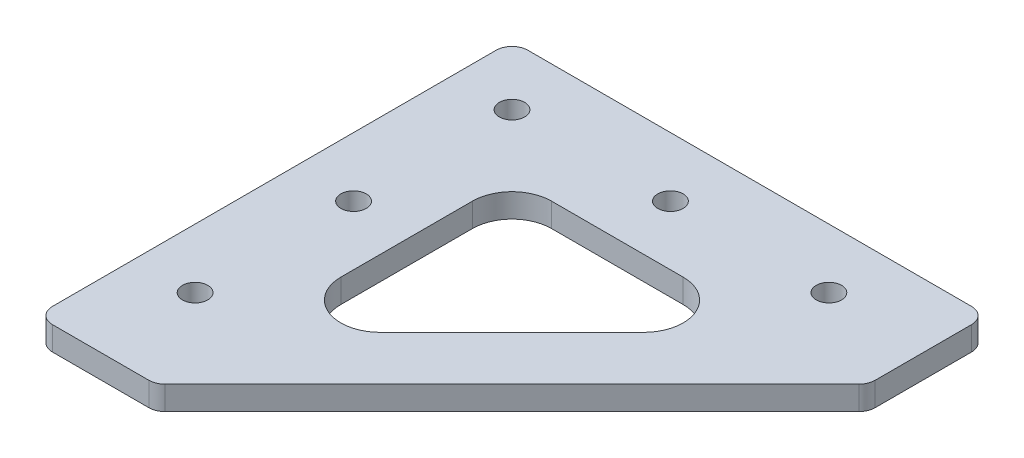
ISO-10303-21;
HEADER;
FILE_DESCRIPTION(('STEP AP214'),'2;1');
FILE_NAME('part.step','',(''),(''),'','','');
FILE_SCHEMA(('AUTOMOTIVE_DESIGN { 1 0 10303 214 1 1 1 1 }'));
ENDSEC;
DATA;
#1=APPLICATION_CONTEXT('core data for automotive mechanical design processes');
#2=APPLICATION_PROTOCOL_DEFINITION('international standard','automotive_design',2000,#1);
#3=PRODUCT_CONTEXT('',#1,'mechanical');
#4=PRODUCT('Part','Part','',(#3));
#5=PRODUCT_RELATED_PRODUCT_CATEGORY('part','',(#4));
#6=PRODUCT_DEFINITION_FORMATION('','',#4);
#7=PRODUCT_DEFINITION_CONTEXT('part definition',#1,'design');
#8=PRODUCT_DEFINITION('design','',#6,#7);
#9=PRODUCT_DEFINITION_SHAPE('','',#8);
#10=(LENGTH_UNIT() NAMED_UNIT(*) SI_UNIT(.MILLI.,.METRE.));
#11=(NAMED_UNIT(*) PLANE_ANGLE_UNIT() SI_UNIT($,.RADIAN.));
#12=(NAMED_UNIT(*) SI_UNIT($,.STERADIAN.) SOLID_ANGLE_UNIT());
#13=UNCERTAINTY_MEASURE_WITH_UNIT(LENGTH_MEASURE(1.E-05),#10,'distance_accuracy_value','');
#14=(GEOMETRIC_REPRESENTATION_CONTEXT(3) GLOBAL_UNCERTAINTY_ASSIGNED_CONTEXT((#13)) GLOBAL_UNIT_ASSIGNED_CONTEXT((#10,
#11,#12)) REPRESENTATION_CONTEXT('',''));
#15=CARTESIAN_POINT('',(0.,0.,0.));
#16=DIRECTION('',(0.,0.,1.));
#17=DIRECTION('',(1.,0.,0.));
#18=AXIS2_PLACEMENT_3D('',#15,#16,#17);
#19=CARTESIAN_POINT('',(0.,3.,0.));
#20=DIRECTION('',(0.,-1.,0.));
#21=DIRECTION('',(0.,0.,-1.));
#22=AXIS2_PLACEMENT_3D('',#19,#20,#21);
#23=PLANE('',#22);
#24=DIRECTION('',(0.,0.,1.));
#25=VECTOR('',#24,1.);
#26=CARTESIAN_POINT('',(-15.,3.,45.));
#27=LINE('',#26,#25);
#28=CARTESIAN_POINT('',(-15.,3.,-13.));
#29=VERTEX_POINT('',#28);
#30=CARTESIAN_POINT('',(-15.,3.,43.));
#31=VERTEX_POINT('',#30);
#32=EDGE_CURVE('E287',#29,#31,#27,.T.);
#33=ORIENTED_EDGE('',*,*,#32,.T.);
#34=CARTESIAN_POINT('',(-13.,3.,43.));
#35=DIRECTION('',(0.,-1.,0.));
#36=DIRECTION('',(0.,0.,-1.));
#37=AXIS2_PLACEMENT_3D('',#34,#35,#36);
#38=CIRCLE('',#37,2.);
#39=CARTESIAN_POINT('',(-13.,3.,45.));
#40=VERTEX_POINT('',#39);
#41=EDGE_CURVE('E211',#31,#40,#38,.F.);
#42=ORIENTED_EDGE('',*,*,#41,.T.);
#43=DIRECTION('',(1.,0.,0.));
#44=VECTOR('',#43,1.);
#45=CARTESIAN_POINT('',(0.,3.,45.));
#46=LINE('',#45,#44);
#47=CARTESIAN_POINT('',(-0.828427124746185,3.,45.));
#48=VERTEX_POINT('',#47);
#49=EDGE_CURVE('E176',#40,#48,#46,.T.);
#50=ORIENTED_EDGE('',*,*,#49,.T.);
#51=CARTESIAN_POINT('',(-0.828427124746185,3.,43.));
#52=DIRECTION('',(0.,-1.,0.));
#53=DIRECTION('',(0.,0.,-1.));
#54=AXIS2_PLACEMENT_3D('',#51,#52,#53);
#55=CIRCLE('',#54,2.);
#56=CARTESIAN_POINT('',(0.58578643762691,3.,44.4142135623731));
#57=VERTEX_POINT('',#56);
#58=EDGE_CURVE('E203',#48,#57,#55,.F.);
#59=ORIENTED_EDGE('',*,*,#58,.T.);
#60=DIRECTION('',(0.707106781186547,0.,-0.707106781186548));
#61=VECTOR('',#60,1.);
#62=CARTESIAN_POINT('',(0.,3.,45.));
#63=LINE('',#62,#61);
#64=CARTESIAN_POINT('',(44.4142135623731,3.,0.585786437626905));
#65=VERTEX_POINT('',#64);
#66=EDGE_CURVE('E183',#57,#65,#63,.T.);
#67=ORIENTED_EDGE('',*,*,#66,.T.);
#68=CARTESIAN_POINT('',(43.,3.,-0.828427124746192));
#69=DIRECTION('',(0.,-1.,0.));
#70=DIRECTION('',(0.,0.,-1.));
#71=AXIS2_PLACEMENT_3D('',#68,#69,#70);
#72=CIRCLE('',#71,2.);
#73=CARTESIAN_POINT('',(45.,3.,-0.828427124746192));
#74=VERTEX_POINT('',#73);
#75=EDGE_CURVE('E205',#65,#74,#72,.F.);
#76=ORIENTED_EDGE('',*,*,#75,.T.);
#77=DIRECTION('',(0.,0.,-1.));
#78=VECTOR('',#77,1.);
#79=CARTESIAN_POINT('',(45.,3.,-15.));
#80=LINE('',#79,#78);
#81=CARTESIAN_POINT('',(45.,3.,-13.));
#82=VERTEX_POINT('',#81);
#83=EDGE_CURVE('E187',#74,#82,#80,.T.);
#84=ORIENTED_EDGE('',*,*,#83,.T.);
#85=CARTESIAN_POINT('',(43.,3.,-13.));
#86=DIRECTION('',(0.,-1.,0.));
#87=DIRECTION('',(0.,0.,-1.));
#88=AXIS2_PLACEMENT_3D('',#85,#86,#87);
#89=CIRCLE('',#88,2.);
#90=CARTESIAN_POINT('',(43.,3.,-15.));
#91=VERTEX_POINT('',#90);
#92=EDGE_CURVE('E207',#82,#91,#89,.F.);
#93=ORIENTED_EDGE('',*,*,#92,.T.);
#94=DIRECTION('',(-1.,0.,0.));
#95=VECTOR('',#94,1.);
#96=CARTESIAN_POINT('',(-15.,3.,-15.));
#97=LINE('',#96,#95);
#98=CARTESIAN_POINT('',(-13.,3.,-15.));
#99=VERTEX_POINT('',#98);
#100=EDGE_CURVE('E284',#91,#99,#97,.T.);
#101=ORIENTED_EDGE('',*,*,#100,.T.);
#102=CARTESIAN_POINT('',(-13.,3.,-13.));
#103=DIRECTION('',(0.,-1.,0.));
#104=DIRECTION('',(0.,0.,-1.));
#105=AXIS2_PLACEMENT_3D('',#102,#103,#104);
#106=CIRCLE('',#105,2.);
#107=EDGE_CURVE('E209',#99,#29,#106,.F.);
#108=ORIENTED_EDGE('',*,*,#107,.T.);
#109=EDGE_LOOP('',(#33,#42,#50,#59,#67,#76,#84,#93,#101,#108));
#110=FACE_BOUND('',#109,.T.);
#111=DIRECTION('',(-1.,0.,0.));
#112=VECTOR('',#111,1.);
#113=CARTESIAN_POINT('',(0.,3.,0.));
#114=LINE('',#113,#112);
#115=CARTESIAN_POINT('',(21.6152236891498,3.,0.));
#116=VERTEX_POINT('',#115);
#117=CARTESIAN_POINT('',(5.,3.,0.));
#118=VERTEX_POINT('',#117);
#119=EDGE_CURVE('E276',#116,#118,#114,.T.);
#120=ORIENTED_EDGE('',*,*,#119,.F.);
#121=CARTESIAN_POINT('',(21.6152236891498,3.,5.));
#122=DIRECTION('',(0.,-1.,0.));
#123=DIRECTION('',(0.,0.,-1.));
#124=AXIS2_PLACEMENT_3D('',#121,#122,#123);
#125=CIRCLE('',#124,5.);
#126=CARTESIAN_POINT('',(25.1507575950825,3.,8.53553390593274));
#127=VERTEX_POINT('',#126);
#128=EDGE_CURVE('E11',#116,#127,#125,.T.);
#129=ORIENTED_EDGE('',*,*,#128,.T.);
#130=DIRECTION('',(0.707106781186548,0.,-0.707106781186548));
#131=VECTOR('',#130,1.);
#132=CARTESIAN_POINT('',(33.6862915010153,3.,0.));
#133=LINE('',#132,#131);
#134=CARTESIAN_POINT('',(8.53553390593274,3.,25.1507575950825));
#135=VERTEX_POINT('',#134);
#136=EDGE_CURVE('E267',#135,#127,#133,.T.);
#137=ORIENTED_EDGE('',*,*,#136,.F.);
#138=CARTESIAN_POINT('',(5.,3.,21.6152236891498));
#139=DIRECTION('',(0.,-1.,0.));
#140=DIRECTION('',(0.,0.,-1.));
#141=AXIS2_PLACEMENT_3D('',#138,#139,#140);
#142=CIRCLE('',#141,5.);
#143=CARTESIAN_POINT('',(0.,3.,21.6152236891498));
#144=VERTEX_POINT('',#143);
#145=EDGE_CURVE('E248',#135,#144,#142,.T.);
#146=ORIENTED_EDGE('',*,*,#145,.T.);
#147=DIRECTION('',(0.,0.,1.));
#148=VECTOR('',#147,1.);
#149=CARTESIAN_POINT('',(0.,3.,33.6862915010153));
#150=LINE('',#149,#148);
#151=CARTESIAN_POINT('',(0.,3.,5.));
#152=VERTEX_POINT('',#151);
#153=EDGE_CURVE('E270',#152,#144,#150,.T.);
#154=ORIENTED_EDGE('',*,*,#153,.F.);
#155=CARTESIAN_POINT('',(5.,3.,5.));
#156=DIRECTION('',(0.,-1.,0.));
#157=DIRECTION('',(0.,0.,-1.));
#158=AXIS2_PLACEMENT_3D('',#155,#156,#157);
#159=CIRCLE('',#158,5.);
#160=EDGE_CURVE('E244',#152,#118,#159,.T.);
#161=ORIENTED_EDGE('',*,*,#160,.T.);
#162=EDGE_LOOP('',(#120,#129,#137,#146,#154,#161));
#163=FACE_BOUND('',#162,.T.);
#164=CARTESIAN_POINT('',(-7.5,3.,12.5));
#165=DIRECTION('',(0.,1.,0.));
#166=DIRECTION('',(0.,0.,1.));
#167=AXIS2_PLACEMENT_3D('',#164,#165,#166);
#168=CIRCLE('',#167,1.6);
#169=CARTESIAN_POINT('',(-7.5,3.,14.1));
#170=VERTEX_POINT('',#169);
#171=EDGE_CURVE('E264',#170,#170,#168,.T.);
#172=ORIENTED_EDGE('',*,*,#171,.F.);
#173=EDGE_LOOP('',(#172));
#174=FACE_BOUND('',#173,.T.);
#175=CARTESIAN_POINT('',(-7.5,3.,32.5));
#176=DIRECTION('',(0.,1.,0.));
#177=DIRECTION('',(0.,0.,1.));
#178=AXIS2_PLACEMENT_3D('',#175,#176,#177);
#179=CIRCLE('',#178,1.6);
#180=CARTESIAN_POINT('',(-7.5,3.,34.1));
#181=VERTEX_POINT('',#180);
#182=EDGE_CURVE('E382',#181,#181,#179,.T.);
#183=ORIENTED_EDGE('',*,*,#182,.F.);
#184=EDGE_LOOP('',(#183));
#185=FACE_BOUND('',#184,.T.);
#186=CARTESIAN_POINT('',(-7.49999999999999,3.,-7.5));
#187=DIRECTION('',(0.,1.,0.));
#188=DIRECTION('',(0.,0.,1.));
#189=AXIS2_PLACEMENT_3D('',#186,#187,#188);
#190=CIRCLE('',#189,1.6);
#191=CARTESIAN_POINT('',(-7.49999999999999,3.,-5.9));
#192=VERTEX_POINT('',#191);
#193=EDGE_CURVE('E376',#192,#192,#190,.T.);
#194=ORIENTED_EDGE('',*,*,#193,.F.);
#195=EDGE_LOOP('',(#194));
#196=FACE_BOUND('',#195,.T.);
#197=CARTESIAN_POINT('',(12.5,3.,-7.5));
#198=DIRECTION('',(0.,1.,0.));
#199=DIRECTION('',(0.,0.,1.));
#200=AXIS2_PLACEMENT_3D('',#197,#198,#199);
#201=CIRCLE('',#200,1.6);
#202=CARTESIAN_POINT('',(12.5,3.,-5.9));
#203=VERTEX_POINT('',#202);
#204=EDGE_CURVE('E370',#203,#203,#201,.T.);
#205=ORIENTED_EDGE('',*,*,#204,.F.);
#206=EDGE_LOOP('',(#205));
#207=FACE_BOUND('',#206,.T.);
#208=CARTESIAN_POINT('',(32.5,3.,-7.5));
#209=DIRECTION('',(0.,1.,0.));
#210=DIRECTION('',(0.,0.,1.));
#211=AXIS2_PLACEMENT_3D('',#208,#209,#210);
#212=CIRCLE('',#211,1.6);
#213=CARTESIAN_POINT('',(32.5,3.,-5.9));
#214=VERTEX_POINT('',#213);
#215=EDGE_CURVE('E361',#214,#214,#212,.T.);
#216=ORIENTED_EDGE('',*,*,#215,.F.);
#217=EDGE_LOOP('',(#216));
#218=FACE_BOUND('',#217,.T.);
#219=ADVANCED_FACE('F43',(#110,#163,#174,#185,#196,#207,#218),#23,.F.);
#220=CARTESIAN_POINT('',(0.,0.,0.));
#221=DIRECTION('',(0.,-1.,0.));
#222=DIRECTION('',(0.,0.,-1.));
#223=AXIS2_PLACEMENT_3D('',#220,#221,#222);
#224=PLANE('',#223);
#225=CARTESIAN_POINT('',(12.5,0.,-7.5));
#226=DIRECTION('',(0.,1.,0.));
#227=DIRECTION('',(0.,0.,1.));
#228=AXIS2_PLACEMENT_3D('',#225,#226,#227);
#229=CIRCLE('',#228,1.6);
#230=CARTESIAN_POINT('',(12.5,0.,-5.9));
#231=VERTEX_POINT('',#230);
#232=EDGE_CURVE('E367',#231,#231,#229,.T.);
#233=ORIENTED_EDGE('',*,*,#232,.T.);
#234=EDGE_LOOP('',(#233));
#235=FACE_BOUND('',#234,.T.);
#236=CARTESIAN_POINT('',(-7.5,0.,32.5));
#237=DIRECTION('',(0.,1.,0.));
#238=DIRECTION('',(0.,0.,1.));
#239=AXIS2_PLACEMENT_3D('',#236,#237,#238);
#240=CIRCLE('',#239,1.6);
#241=CARTESIAN_POINT('',(-7.5,0.,34.1));
#242=VERTEX_POINT('',#241);
#243=EDGE_CURVE('E379',#242,#242,#240,.T.);
#244=ORIENTED_EDGE('',*,*,#243,.T.);
#245=EDGE_LOOP('',(#244));
#246=FACE_BOUND('',#245,.T.);
#247=DIRECTION('',(0.,0.,1.));
#248=VECTOR('',#247,1.);
#249=CARTESIAN_POINT('',(0.,0.,33.6862915010153));
#250=LINE('',#249,#248);
#251=CARTESIAN_POINT('',(0.,0.,5.));
#252=VERTEX_POINT('',#251);
#253=CARTESIAN_POINT('',(0.,0.,21.6152236891498));
#254=VERTEX_POINT('',#253);
#255=EDGE_CURVE('E263',#252,#254,#250,.T.);
#256=ORIENTED_EDGE('',*,*,#255,.T.);
#257=CARTESIAN_POINT('',(5.,0.,21.6152236891498));
#258=DIRECTION('',(0.,-1.,0.));
#259=DIRECTION('',(0.,0.,-1.));
#260=AXIS2_PLACEMENT_3D('',#257,#258,#259);
#261=CIRCLE('',#260,5.);
#262=CARTESIAN_POINT('',(8.53553390593274,0.,25.1507575950825));
#263=VERTEX_POINT('',#262);
#264=EDGE_CURVE('E246',#254,#263,#261,.F.);
#265=ORIENTED_EDGE('',*,*,#264,.T.);
#266=DIRECTION('',(0.707106781186548,0.,-0.707106781186548));
#267=VECTOR('',#266,1.);
#268=CARTESIAN_POINT('',(33.6862915010153,0.,0.));
#269=LINE('',#268,#267);
#270=CARTESIAN_POINT('',(25.1507575950825,0.,8.53553390593274));
#271=VERTEX_POINT('',#270);
#272=EDGE_CURVE('E255',#263,#271,#269,.T.);
#273=ORIENTED_EDGE('',*,*,#272,.T.);
#274=CARTESIAN_POINT('',(21.6152236891498,0.,5.));
#275=DIRECTION('',(0.,-1.,0.));
#276=DIRECTION('',(0.,0.,-1.));
#277=AXIS2_PLACEMENT_3D('',#274,#275,#276);
#278=CIRCLE('',#277,5.);
#279=CARTESIAN_POINT('',(21.6152236891498,0.,0.));
#280=VERTEX_POINT('',#279);
#281=EDGE_CURVE('E51',#271,#280,#278,.F.);
#282=ORIENTED_EDGE('',*,*,#281,.T.);
#283=DIRECTION('',(-1.,0.,0.));
#284=VECTOR('',#283,1.);
#285=CARTESIAN_POINT('',(0.,0.,0.));
#286=LINE('',#285,#284);
#287=CARTESIAN_POINT('',(5.,0.,0.));
#288=VERTEX_POINT('',#287);
#289=EDGE_CURVE('E254',#280,#288,#286,.T.);
#290=ORIENTED_EDGE('',*,*,#289,.T.);
#291=CARTESIAN_POINT('',(5.,0.,5.));
#292=DIRECTION('',(0.,-1.,0.));
#293=DIRECTION('',(0.,0.,-1.));
#294=AXIS2_PLACEMENT_3D('',#291,#292,#293);
#295=CIRCLE('',#294,5.);
#296=EDGE_CURVE('E242',#288,#252,#295,.F.);
#297=ORIENTED_EDGE('',*,*,#296,.T.);
#298=EDGE_LOOP('',(#256,#265,#273,#282,#290,#297));
#299=FACE_BOUND('',#298,.T.);
#300=DIRECTION('',(1.,0.,0.));
#301=VECTOR('',#300,1.);
#302=CARTESIAN_POINT('',(0.,0.,45.));
#303=LINE('',#302,#301);
#304=CARTESIAN_POINT('',(-13.,0.,45.));
#305=VERTEX_POINT('',#304);
#306=CARTESIAN_POINT('',(-0.828427124746185,0.,45.));
#307=VERTEX_POINT('',#306);
#308=EDGE_CURVE('E173',#305,#307,#303,.T.);
#309=ORIENTED_EDGE('',*,*,#308,.F.);
#310=CARTESIAN_POINT('',(-13.,0.,43.));
#311=DIRECTION('',(0.,-1.,0.));
#312=DIRECTION('',(0.,0.,-1.));
#313=AXIS2_PLACEMENT_3D('',#310,#311,#312);
#314=CIRCLE('',#313,2.);
#315=CARTESIAN_POINT('',(-15.,0.,43.));
#316=VERTEX_POINT('',#315);
#317=EDGE_CURVE('E156',#305,#316,#314,.T.);
#318=ORIENTED_EDGE('',*,*,#317,.T.);
#319=DIRECTION('',(0.,0.,1.));
#320=VECTOR('',#319,1.);
#321=CARTESIAN_POINT('',(-15.,0.,45.));
#322=LINE('',#321,#320);
#323=CARTESIAN_POINT('',(-15.,0.,-13.));
#324=VERTEX_POINT('',#323);
#325=EDGE_CURVE('E184',#324,#316,#322,.T.);
#326=ORIENTED_EDGE('',*,*,#325,.F.);
#327=CARTESIAN_POINT('',(-13.,0.,-13.));
#328=DIRECTION('',(0.,-1.,0.));
#329=DIRECTION('',(0.,0.,-1.));
#330=AXIS2_PLACEMENT_3D('',#327,#328,#329);
#331=CIRCLE('',#330,2.);
#332=CARTESIAN_POINT('',(-13.,0.,-15.));
#333=VERTEX_POINT('',#332);
#334=EDGE_CURVE('E167',#324,#333,#331,.T.);
#335=ORIENTED_EDGE('',*,*,#334,.T.);
#336=DIRECTION('',(-1.,0.,0.));
#337=VECTOR('',#336,1.);
#338=CARTESIAN_POINT('',(-15.,0.,-15.));
#339=LINE('',#338,#337);
#340=CARTESIAN_POINT('',(43.,0.,-15.));
#341=VERTEX_POINT('',#340);
#342=EDGE_CURVE('E189',#341,#333,#339,.T.);
#343=ORIENTED_EDGE('',*,*,#342,.F.);
#344=CARTESIAN_POINT('',(43.,0.,-13.));
#345=DIRECTION('',(0.,-1.,0.));
#346=DIRECTION('',(0.,0.,-1.));
#347=AXIS2_PLACEMENT_3D('',#344,#345,#346);
#348=CIRCLE('',#347,2.);
#349=CARTESIAN_POINT('',(45.,0.,-13.));
#350=VERTEX_POINT('',#349);
#351=EDGE_CURVE('E197',#341,#350,#348,.T.);
#352=ORIENTED_EDGE('',*,*,#351,.T.);
#353=DIRECTION('',(0.,0.,-1.));
#354=VECTOR('',#353,1.);
#355=CARTESIAN_POINT('',(45.,0.,-15.));
#356=LINE('',#355,#354);
#357=CARTESIAN_POINT('',(45.,0.,-0.828427124746192));
#358=VERTEX_POINT('',#357);
#359=EDGE_CURVE('E273',#358,#350,#356,.T.);
#360=ORIENTED_EDGE('',*,*,#359,.F.);
#361=CARTESIAN_POINT('',(43.,0.,-0.828427124746192));
#362=DIRECTION('',(0.,-1.,0.));
#363=DIRECTION('',(0.,0.,-1.));
#364=AXIS2_PLACEMENT_3D('',#361,#362,#363);
#365=CIRCLE('',#364,2.);
#366=CARTESIAN_POINT('',(44.4142135623731,0.,0.585786437626905));
#367=VERTEX_POINT('',#366);
#368=EDGE_CURVE('E195',#358,#367,#365,.T.);
#369=ORIENTED_EDGE('',*,*,#368,.T.);
#370=DIRECTION('',(0.707106781186547,0.,-0.707106781186548));
#371=VECTOR('',#370,1.);
#372=CARTESIAN_POINT('',(0.,0.,45.));
#373=LINE('',#372,#371);
#374=CARTESIAN_POINT('',(0.58578643762691,0.,44.4142135623731));
#375=VERTEX_POINT('',#374);
#376=EDGE_CURVE('E269',#375,#367,#373,.T.);
#377=ORIENTED_EDGE('',*,*,#376,.F.);
#378=CARTESIAN_POINT('',(-0.828427124746185,0.,43.));
#379=DIRECTION('',(0.,-1.,0.));
#380=DIRECTION('',(0.,0.,-1.));
#381=AXIS2_PLACEMENT_3D('',#378,#379,#380);
#382=CIRCLE('',#381,2.);
#383=EDGE_CURVE('E177',#375,#307,#382,.T.);
#384=ORIENTED_EDGE('',*,*,#383,.T.);
#385=EDGE_LOOP('',(#309,#318,#326,#335,#343,#352,#360,#369,#377,#384));
#386=FACE_BOUND('',#385,.T.);
#387=CARTESIAN_POINT('',(-7.5,0.,12.5));
#388=DIRECTION('',(0.,1.,0.));
#389=DIRECTION('',(0.,0.,1.));
#390=AXIS2_PLACEMENT_3D('',#387,#388,#389);
#391=CIRCLE('',#390,1.6);
#392=CARTESIAN_POINT('',(-7.5,0.,14.1));
#393=VERTEX_POINT('',#392);
#394=EDGE_CURVE('E385',#393,#393,#391,.T.);
#395=ORIENTED_EDGE('',*,*,#394,.T.);
#396=EDGE_LOOP('',(#395));
#397=FACE_BOUND('',#396,.T.);
#398=CARTESIAN_POINT('',(-7.49999999999999,0.,-7.5));
#399=DIRECTION('',(0.,1.,0.));
#400=DIRECTION('',(0.,0.,1.));
#401=AXIS2_PLACEMENT_3D('',#398,#399,#400);
#402=CIRCLE('',#401,1.6);
#403=CARTESIAN_POINT('',(-7.49999999999999,0.,-5.9));
#404=VERTEX_POINT('',#403);
#405=EDGE_CURVE('E373',#404,#404,#402,.T.);
#406=ORIENTED_EDGE('',*,*,#405,.T.);
#407=EDGE_LOOP('',(#406));
#408=FACE_BOUND('',#407,.T.);
#409=CARTESIAN_POINT('',(32.5,0.,-7.5));
#410=DIRECTION('',(0.,1.,0.));
#411=DIRECTION('',(0.,0.,1.));
#412=AXIS2_PLACEMENT_3D('',#409,#410,#411);
#413=CIRCLE('',#412,1.6);
#414=CARTESIAN_POINT('',(32.5,0.,-5.9));
#415=VERTEX_POINT('',#414);
#416=EDGE_CURVE('E364',#415,#415,#413,.T.);
#417=ORIENTED_EDGE('',*,*,#416,.T.);
#418=EDGE_LOOP('',(#417));
#419=FACE_BOUND('',#418,.T.);
#420=ADVANCED_FACE('F180',(#235,#246,#299,#386,#397,#408,#419),#224,.T.);
#421=CARTESIAN_POINT('',(0.,3.,45.));
#422=DIRECTION('',(-0.707106781186548,0.,-0.707106781186547));
#423=DIRECTION('',(-0.707106781186547,0.,0.707106781186548));
#424=AXIS2_PLACEMENT_3D('',#421,#422,#423);
#425=PLANE('',#424);
#426=ORIENTED_EDGE('',*,*,#376,.T.);
#427=DIRECTION('',(0.,-1.,0.));
#428=VECTOR('',#427,1.);
#429=CARTESIAN_POINT('',(44.4142135623731,3.,0.585786437626905));
#430=LINE('',#429,#428);
#431=EDGE_CURVE('E226',#367,#65,#430,.F.);
#432=ORIENTED_EDGE('',*,*,#431,.T.);
#433=ORIENTED_EDGE('',*,*,#66,.F.);
#434=DIRECTION('',(0.,-1.,0.));
#435=VECTOR('',#434,1.);
#436=CARTESIAN_POINT('',(0.585786437626911,3.,44.4142135623731));
#437=LINE('',#436,#435);
#438=EDGE_CURVE('E223',#57,#375,#437,.T.);
#439=ORIENTED_EDGE('',*,*,#438,.T.);
#440=EDGE_LOOP('',(#426,#432,#433,#439));
#441=FACE_BOUND('',#440,.T.);
#442=ADVANCED_FACE('F322',(#441),#425,.F.);
#443=CARTESIAN_POINT('',(45.,3.,-15.));
#444=DIRECTION('',(-1.,0.,0.));
#445=DIRECTION('',(0.,0.,1.));
#446=AXIS2_PLACEMENT_3D('',#443,#444,#445);
#447=PLANE('',#446);
#448=ORIENTED_EDGE('',*,*,#359,.T.);
#449=DIRECTION('',(0.,-1.,0.));
#450=VECTOR('',#449,1.);
#451=CARTESIAN_POINT('',(45.,3.,-13.));
#452=LINE('',#451,#450);
#453=EDGE_CURVE('E221',#350,#82,#452,.F.);
#454=ORIENTED_EDGE('',*,*,#453,.T.);
#455=ORIENTED_EDGE('',*,*,#83,.F.);
#456=DIRECTION('',(0.,-1.,0.));
#457=VECTOR('',#456,1.);
#458=CARTESIAN_POINT('',(45.,3.,-0.828427124746192));
#459=LINE('',#458,#457);
#460=EDGE_CURVE('E218',#74,#358,#459,.T.);
#461=ORIENTED_EDGE('',*,*,#460,.T.);
#462=EDGE_LOOP('',(#448,#454,#455,#461));
#463=FACE_BOUND('',#462,.T.);
#464=ADVANCED_FACE('F314',(#463),#447,.F.);
#465=CARTESIAN_POINT('',(-15.,3.,-15.));
#466=DIRECTION('',(0.,0.,1.));
#467=DIRECTION('',(1.,0.,0.));
#468=AXIS2_PLACEMENT_3D('',#465,#466,#467);
#469=PLANE('',#468);
#470=ORIENTED_EDGE('',*,*,#342,.T.);
#471=DIRECTION('',(0.,-1.,0.));
#472=VECTOR('',#471,1.);
#473=CARTESIAN_POINT('',(-13.,3.,-15.));
#474=LINE('',#473,#472);
#475=EDGE_CURVE('E216',#333,#99,#474,.F.);
#476=ORIENTED_EDGE('',*,*,#475,.T.);
#477=ORIENTED_EDGE('',*,*,#100,.F.);
#478=DIRECTION('',(0.,-1.,0.));
#479=VECTOR('',#478,1.);
#480=CARTESIAN_POINT('',(43.,3.,-15.));
#481=LINE('',#480,#479);
#482=EDGE_CURVE('E213',#91,#341,#481,.T.);
#483=ORIENTED_EDGE('',*,*,#482,.T.);
#484=EDGE_LOOP('',(#470,#476,#477,#483));
#485=FACE_BOUND('',#484,.T.);
#486=ADVANCED_FACE('F296',(#485),#469,.F.);
#487=CARTESIAN_POINT('',(-15.,3.,45.));
#488=DIRECTION('',(1.,0.,0.));
#489=DIRECTION('',(0.,0.,-1.));
#490=AXIS2_PLACEMENT_3D('',#487,#488,#489);
#491=PLANE('',#490);
#492=ORIENTED_EDGE('',*,*,#325,.T.);
#493=DIRECTION('',(0.,-1.,0.));
#494=VECTOR('',#493,1.);
#495=CARTESIAN_POINT('',(-15.,3.,43.));
#496=LINE('',#495,#494);
#497=EDGE_CURVE('E161',#316,#31,#496,.F.);
#498=ORIENTED_EDGE('',*,*,#497,.T.);
#499=ORIENTED_EDGE('',*,*,#32,.F.);
#500=DIRECTION('',(0.,-1.,0.));
#501=VECTOR('',#500,1.);
#502=CARTESIAN_POINT('',(-15.,3.,-13.));
#503=LINE('',#502,#501);
#504=EDGE_CURVE('E166',#29,#324,#503,.T.);
#505=ORIENTED_EDGE('',*,*,#504,.T.);
#506=EDGE_LOOP('',(#492,#498,#499,#505));
#507=FACE_BOUND('',#506,.T.);
#508=ADVANCED_FACE('F306',(#507),#491,.F.);
#509=CARTESIAN_POINT('',(0.,3.,45.));
#510=DIRECTION('',(0.,0.,-1.));
#511=DIRECTION('',(-1.,0.,0.));
#512=AXIS2_PLACEMENT_3D('',#509,#510,#511);
#513=PLANE('',#512);
#514=ORIENTED_EDGE('',*,*,#49,.F.);
#515=DIRECTION('',(0.,-1.,0.));
#516=VECTOR('',#515,1.);
#517=CARTESIAN_POINT('',(-13.,3.,45.));
#518=LINE('',#517,#516);
#519=EDGE_CURVE('E160',#40,#305,#518,.T.);
#520=ORIENTED_EDGE('',*,*,#519,.T.);
#521=ORIENTED_EDGE('',*,*,#308,.T.);
#522=DIRECTION('',(0.,-1.,0.));
#523=VECTOR('',#522,1.);
#524=CARTESIAN_POINT('',(-0.828427124746185,3.,45.));
#525=LINE('',#524,#523);
#526=EDGE_CURVE('E178',#307,#48,#525,.F.);
#527=ORIENTED_EDGE('',*,*,#526,.T.);
#528=EDGE_LOOP('',(#514,#520,#521,#527));
#529=FACE_BOUND('',#528,.T.);
#530=ADVANCED_FACE('F172',(#529),#513,.F.);
#531=CARTESIAN_POINT('',(0.,3.,0.));
#532=DIRECTION('',(0.,0.,1.));
#533=DIRECTION('',(1.,0.,0.));
#534=AXIS2_PLACEMENT_3D('',#531,#532,#533);
#535=PLANE('',#534);
#536=ORIENTED_EDGE('',*,*,#119,.T.);
#537=DIRECTION('',(0.,-1.,0.));
#538=VECTOR('',#537,1.);
#539=CARTESIAN_POINT('',(5.,0.,0.));
#540=LINE('',#539,#538);
#541=EDGE_CURVE('E230',#118,#288,#540,.T.);
#542=ORIENTED_EDGE('',*,*,#541,.T.);
#543=ORIENTED_EDGE('',*,*,#289,.F.);
#544=DIRECTION('',(0.,-1.,0.));
#545=VECTOR('',#544,1.);
#546=CARTESIAN_POINT('',(21.6152236891498,3.,0.));
#547=LINE('',#546,#545);
#548=EDGE_CURVE('E228',#280,#116,#547,.F.);
#549=ORIENTED_EDGE('',*,*,#548,.T.);
#550=EDGE_LOOP('',(#536,#542,#543,#549));
#551=FACE_BOUND('',#550,.T.);
#552=ADVANCED_FACE('F261',(#551),#535,.T.);
#553=CARTESIAN_POINT('',(0.,3.,33.6862915010153));
#554=DIRECTION('',(1.,0.,0.));
#555=DIRECTION('',(0.,0.,-1.));
#556=AXIS2_PLACEMENT_3D('',#553,#554,#555);
#557=PLANE('',#556);
#558=ORIENTED_EDGE('',*,*,#255,.F.);
#559=DIRECTION('',(0.,-1.,0.));
#560=VECTOR('',#559,1.);
#561=CARTESIAN_POINT('',(0.,3.,5.));
#562=LINE('',#561,#560);
#563=EDGE_CURVE('E236',#252,#152,#562,.F.);
#564=ORIENTED_EDGE('',*,*,#563,.T.);
#565=ORIENTED_EDGE('',*,*,#153,.T.);
#566=DIRECTION('',(0.,-1.,0.));
#567=VECTOR('',#566,1.);
#568=CARTESIAN_POINT('',(0.,0.,21.6152236891498));
#569=LINE('',#568,#567);
#570=EDGE_CURVE('E233',#144,#254,#569,.T.);
#571=ORIENTED_EDGE('',*,*,#570,.T.);
#572=EDGE_LOOP('',(#558,#564,#565,#571));
#573=FACE_BOUND('',#572,.T.);
#574=ADVANCED_FACE('F328',(#573),#557,.T.);
#575=CARTESIAN_POINT('',(33.6862915010153,3.,0.));
#576=DIRECTION('',(-0.707106781186547,0.,-0.707106781186547));
#577=DIRECTION('',(-0.707106781186548,0.,0.707106781186548));
#578=AXIS2_PLACEMENT_3D('',#575,#576,#577);
#579=PLANE('',#578);
#580=ORIENTED_EDGE('',*,*,#272,.F.);
#581=DIRECTION('',(0.,-1.,0.));
#582=VECTOR('',#581,1.);
#583=CARTESIAN_POINT('',(8.53553390593274,3.,25.1507575950825));
#584=LINE('',#583,#582);
#585=EDGE_CURVE('E63',#263,#135,#584,.F.);
#586=ORIENTED_EDGE('',*,*,#585,.T.);
#587=ORIENTED_EDGE('',*,*,#136,.T.);
#588=DIRECTION('',(0.,-1.,0.));
#589=VECTOR('',#588,1.);
#590=CARTESIAN_POINT('',(25.1507575950825,0.,8.53553390593274));
#591=LINE('',#590,#589);
#592=EDGE_CURVE('E238',#127,#271,#591,.T.);
#593=ORIENTED_EDGE('',*,*,#592,.T.);
#594=EDGE_LOOP('',(#580,#586,#587,#593));
#595=FACE_BOUND('',#594,.T.);
#596=ADVANCED_FACE('F266',(#595),#579,.T.);
#597=CARTESIAN_POINT('',(-7.5,3.,12.5));
#598=DIRECTION('',(0.,-1.,0.));
#599=DIRECTION('',(0.,0.,-1.));
#600=AXIS2_PLACEMENT_3D('',#597,#598,#599);
#601=CYLINDRICAL_SURFACE('',#600,1.6);
#602=ORIENTED_EDGE('',*,*,#171,.T.);
#603=EDGE_LOOP('',(#602));
#604=FACE_BOUND('',#603,.T.);
#605=ORIENTED_EDGE('',*,*,#394,.F.);
#606=EDGE_LOOP('',(#605));
#607=FACE_BOUND('',#606,.T.);
#608=ADVANCED_FACE('F334',(#604,#607),#601,.F.);
#609=CARTESIAN_POINT('',(-7.5,3.,32.5));
#610=DIRECTION('',(0.,-1.,0.));
#611=DIRECTION('',(0.,0.,-1.));
#612=AXIS2_PLACEMENT_3D('',#609,#610,#611);
#613=CYLINDRICAL_SURFACE('',#612,1.6);
#614=ORIENTED_EDGE('',*,*,#182,.T.);
#615=EDGE_LOOP('',(#614));
#616=FACE_BOUND('',#615,.T.);
#617=ORIENTED_EDGE('',*,*,#243,.F.);
#618=EDGE_LOOP('',(#617));
#619=FACE_BOUND('',#618,.T.);
#620=ADVANCED_FACE('F337',(#616,#619),#613,.F.);
#621=CARTESIAN_POINT('',(-7.49999999999999,3.,-7.5));
#622=DIRECTION('',(0.,-1.,0.));
#623=DIRECTION('',(0.,0.,-1.));
#624=AXIS2_PLACEMENT_3D('',#621,#622,#623);
#625=CYLINDRICAL_SURFACE('',#624,1.6);
#626=ORIENTED_EDGE('',*,*,#193,.T.);
#627=EDGE_LOOP('',(#626));
#628=FACE_BOUND('',#627,.T.);
#629=ORIENTED_EDGE('',*,*,#405,.F.);
#630=EDGE_LOOP('',(#629));
#631=FACE_BOUND('',#630,.T.);
#632=ADVANCED_FACE('F341',(#628,#631),#625,.F.);
#633=CARTESIAN_POINT('',(12.5,3.,-7.5));
#634=DIRECTION('',(0.,-1.,0.));
#635=DIRECTION('',(0.,0.,-1.));
#636=AXIS2_PLACEMENT_3D('',#633,#634,#635);
#637=CYLINDRICAL_SURFACE('',#636,1.6);
#638=ORIENTED_EDGE('',*,*,#204,.T.);
#639=EDGE_LOOP('',(#638));
#640=FACE_BOUND('',#639,.T.);
#641=ORIENTED_EDGE('',*,*,#232,.F.);
#642=EDGE_LOOP('',(#641));
#643=FACE_BOUND('',#642,.T.);
#644=ADVANCED_FACE('F345',(#640,#643),#637,.F.);
#645=CARTESIAN_POINT('',(32.5,3.,-7.5));
#646=DIRECTION('',(0.,-1.,0.));
#647=DIRECTION('',(0.,0.,-1.));
#648=AXIS2_PLACEMENT_3D('',#645,#646,#647);
#649=CYLINDRICAL_SURFACE('',#648,1.6);
#650=ORIENTED_EDGE('',*,*,#215,.T.);
#651=EDGE_LOOP('',(#650));
#652=FACE_BOUND('',#651,.T.);
#653=ORIENTED_EDGE('',*,*,#416,.F.);
#654=EDGE_LOOP('',(#653));
#655=FACE_BOUND('',#654,.T.);
#656=ADVANCED_FACE('F349',(#652,#655),#649,.F.);
#657=CARTESIAN_POINT('',(-13.,3.,43.));
#658=DIRECTION('',(0.,-1.,0.));
#659=DIRECTION('',(0.,0.,-1.));
#660=AXIS2_PLACEMENT_3D('',#657,#658,#659);
#661=CYLINDRICAL_SURFACE('',#660,2.);
#662=ORIENTED_EDGE('',*,*,#41,.F.);
#663=ORIENTED_EDGE('',*,*,#497,.F.);
#664=ORIENTED_EDGE('',*,*,#317,.F.);
#665=ORIENTED_EDGE('',*,*,#519,.F.);
#666=EDGE_LOOP('',(#662,#663,#664,#665));
#667=FACE_BOUND('',#666,.T.);
#668=ADVANCED_FACE('F159',(#667),#661,.T.);
#669=CARTESIAN_POINT('',(-13.,3.,-13.));
#670=DIRECTION('',(0.,-1.,0.));
#671=DIRECTION('',(0.,0.,-1.));
#672=AXIS2_PLACEMENT_3D('',#669,#670,#671);
#673=CYLINDRICAL_SURFACE('',#672,2.);
#674=ORIENTED_EDGE('',*,*,#107,.F.);
#675=ORIENTED_EDGE('',*,*,#475,.F.);
#676=ORIENTED_EDGE('',*,*,#334,.F.);
#677=ORIENTED_EDGE('',*,*,#504,.F.);
#678=EDGE_LOOP('',(#674,#675,#676,#677));
#679=FACE_BOUND('',#678,.T.);
#680=ADVANCED_FACE('F301',(#679),#673,.T.);
#681=CARTESIAN_POINT('',(43.,3.,-13.));
#682=DIRECTION('',(0.,-1.,0.));
#683=DIRECTION('',(0.,0.,-1.));
#684=AXIS2_PLACEMENT_3D('',#681,#682,#683);
#685=CYLINDRICAL_SURFACE('',#684,2.);
#686=ORIENTED_EDGE('',*,*,#92,.F.);
#687=ORIENTED_EDGE('',*,*,#453,.F.);
#688=ORIENTED_EDGE('',*,*,#351,.F.);
#689=ORIENTED_EDGE('',*,*,#482,.F.);
#690=EDGE_LOOP('',(#686,#687,#688,#689));
#691=FACE_BOUND('',#690,.T.);
#692=ADVANCED_FACE('F432',(#691),#685,.T.);
#693=CARTESIAN_POINT('',(43.,3.,-0.828427124746192));
#694=DIRECTION('',(0.,-1.,0.));
#695=DIRECTION('',(0.,0.,-1.));
#696=AXIS2_PLACEMENT_3D('',#693,#694,#695);
#697=CYLINDRICAL_SURFACE('',#696,2.);
#698=ORIENTED_EDGE('',*,*,#75,.F.);
#699=ORIENTED_EDGE('',*,*,#431,.F.);
#700=ORIENTED_EDGE('',*,*,#368,.F.);
#701=ORIENTED_EDGE('',*,*,#460,.F.);
#702=EDGE_LOOP('',(#698,#699,#700,#701));
#703=FACE_BOUND('',#702,.T.);
#704=ADVANCED_FACE('F428',(#703),#697,.T.);
#705=CARTESIAN_POINT('',(-0.828427124746185,3.,43.));
#706=DIRECTION('',(0.,-1.,0.));
#707=DIRECTION('',(0.,0.,-1.));
#708=AXIS2_PLACEMENT_3D('',#705,#706,#707);
#709=CYLINDRICAL_SURFACE('',#708,2.);
#710=ORIENTED_EDGE('',*,*,#58,.F.);
#711=ORIENTED_EDGE('',*,*,#526,.F.);
#712=ORIENTED_EDGE('',*,*,#383,.F.);
#713=ORIENTED_EDGE('',*,*,#438,.F.);
#714=EDGE_LOOP('',(#710,#711,#712,#713));
#715=FACE_BOUND('',#714,.T.);
#716=ADVANCED_FACE('F424',(#715),#709,.T.);
#717=CARTESIAN_POINT('',(5.,3.,5.));
#718=DIRECTION('',(0.,1.,0.));
#719=DIRECTION('',(0.,0.,1.));
#720=AXIS2_PLACEMENT_3D('',#717,#718,#719);
#721=CYLINDRICAL_SURFACE('',#720,5.);
#722=ORIENTED_EDGE('',*,*,#160,.F.);
#723=ORIENTED_EDGE('',*,*,#563,.F.);
#724=ORIENTED_EDGE('',*,*,#296,.F.);
#725=ORIENTED_EDGE('',*,*,#541,.F.);
#726=EDGE_LOOP('',(#722,#723,#724,#725));
#727=FACE_BOUND('',#726,.T.);
#728=ADVANCED_FACE('F393',(#727),#721,.F.);
#729=CARTESIAN_POINT('',(5.,3.,21.6152236891498));
#730=DIRECTION('',(0.,1.,0.));
#731=DIRECTION('',(0.,0.,1.));
#732=AXIS2_PLACEMENT_3D('',#729,#730,#731);
#733=CYLINDRICAL_SURFACE('',#732,5.);
#734=ORIENTED_EDGE('',*,*,#145,.F.);
#735=ORIENTED_EDGE('',*,*,#585,.F.);
#736=ORIENTED_EDGE('',*,*,#264,.F.);
#737=ORIENTED_EDGE('',*,*,#570,.F.);
#738=EDGE_LOOP('',(#734,#735,#736,#737));
#739=FACE_BOUND('',#738,.T.);
#740=ADVANCED_FACE('F399',(#739),#733,.F.);
#741=CARTESIAN_POINT('',(21.6152236891498,3.,5.));
#742=DIRECTION('',(0.,1.,0.));
#743=DIRECTION('',(0.,0.,1.));
#744=AXIS2_PLACEMENT_3D('',#741,#742,#743);
#745=CYLINDRICAL_SURFACE('',#744,5.);
#746=ORIENTED_EDGE('',*,*,#128,.F.);
#747=ORIENTED_EDGE('',*,*,#548,.F.);
#748=ORIENTED_EDGE('',*,*,#281,.F.);
#749=ORIENTED_EDGE('',*,*,#592,.F.);
#750=EDGE_LOOP('',(#746,#747,#748,#749));
#751=FACE_BOUND('',#750,.T.);
#752=ADVANCED_FACE('F45',(#751),#745,.F.);
#753=CLOSED_SHELL('',(#219,#420,#442,#464,#486,#508,#530,#552,#574,#596,#608,#620,#632,#644,
#656,#668,#680,#692,#704,#716,#728,#740,#752));
#754=MANIFOLD_SOLID_BREP('B2',#753);
#755=ADVANCED_BREP_SHAPE_REPRESENTATION('',(#18,#754),#14);
#756=SHAPE_DEFINITION_REPRESENTATION(#9,#755);
ENDSEC;
END-ISO-10303-21;
